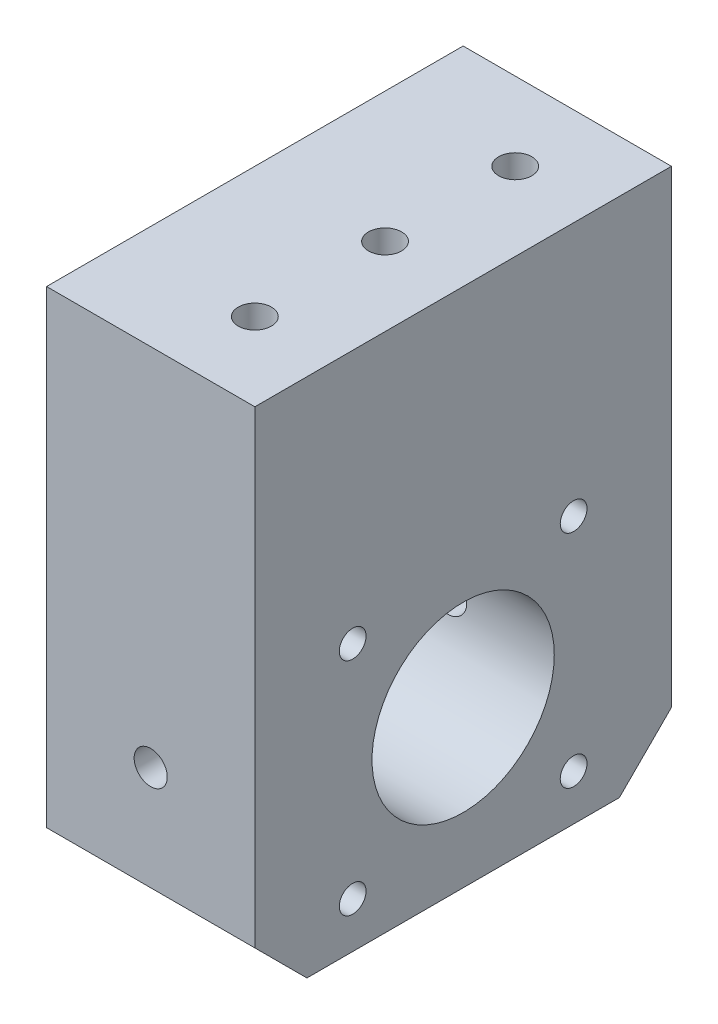
ISO-10303-21;
HEADER;
FILE_DESCRIPTION(('STEP AP214'),'2;1');
FILE_NAME('part.step','',(''),(''),'','','');
FILE_SCHEMA(('AUTOMOTIVE_DESIGN { 1 0 10303 214 1 1 1 1 }'));
ENDSEC;
DATA;
#1=APPLICATION_CONTEXT('core data for automotive mechanical design processes');
#2=APPLICATION_PROTOCOL_DEFINITION('international standard','automotive_design',2000,#1);
#3=PRODUCT_CONTEXT('',#1,'mechanical');
#4=PRODUCT('Part','Part','',(#3));
#5=PRODUCT_RELATED_PRODUCT_CATEGORY('part','',(#4));
#6=PRODUCT_DEFINITION_FORMATION('','',#4);
#7=PRODUCT_DEFINITION_CONTEXT('part definition',#1,'design');
#8=PRODUCT_DEFINITION('design','',#6,#7);
#9=PRODUCT_DEFINITION_SHAPE('','',#8);
#10=(LENGTH_UNIT() NAMED_UNIT(*) SI_UNIT(.MILLI.,.METRE.));
#11=(NAMED_UNIT(*) PLANE_ANGLE_UNIT() SI_UNIT($,.RADIAN.));
#12=(NAMED_UNIT(*) SI_UNIT($,.STERADIAN.) SOLID_ANGLE_UNIT());
#13=UNCERTAINTY_MEASURE_WITH_UNIT(LENGTH_MEASURE(1.E-05),#10,'distance_accuracy_value','');
#14=(GEOMETRIC_REPRESENTATION_CONTEXT(3) GLOBAL_UNCERTAINTY_ASSIGNED_CONTEXT((#13)) GLOBAL_UNIT_ASSIGNED_CONTEXT((#10,
#11,#12)) REPRESENTATION_CONTEXT('',''));
#15=CARTESIAN_POINT('',(0.,0.,0.));
#16=DIRECTION('',(0.,0.,1.));
#17=DIRECTION('',(1.,0.,0.));
#18=AXIS2_PLACEMENT_3D('',#15,#16,#17);
#19=CARTESIAN_POINT('',(25.4,-31.75,-25.4));
#20=DIRECTION('',(0.,0.,1.));
#21=DIRECTION('',(1.,0.,0.));
#22=AXIS2_PLACEMENT_3D('',#19,#20,#21);
#23=PLANE('',#22);
#24=CARTESIAN_POINT('',(12.7,-12.7,-25.4));
#25=DIRECTION('',(0.,0.,-1.));
#26=DIRECTION('',(-1.,0.,0.));
#27=AXIS2_PLACEMENT_3D('',#24,#25,#26);
#28=CIRCLE('',#27,2.0193);
#29=CARTESIAN_POINT('',(10.6807,-12.7,-25.4));
#30=VERTEX_POINT('',#29);
#31=EDGE_CURVE('E371',#30,#30,#28,.T.);
#32=ORIENTED_EDGE('',*,*,#31,.F.);
#33=EDGE_LOOP('',(#32));
#34=FACE_BOUND('',#33,.T.);
#35=DIRECTION('',(0.,1.,0.));
#36=VECTOR('',#35,1.);
#37=CARTESIAN_POINT('',(25.4,-31.75,-25.4));
#38=LINE('',#37,#36);
#39=CARTESIAN_POINT('',(25.4,-25.4,-25.4));
#40=VERTEX_POINT('',#39);
#41=CARTESIAN_POINT('',(25.4,31.75,-25.4));
#42=VERTEX_POINT('',#41);
#43=EDGE_CURVE('E142',#40,#42,#38,.T.);
#44=ORIENTED_EDGE('',*,*,#43,.F.);
#45=DIRECTION('',(-1.,0.,0.));
#46=VECTOR('',#45,1.);
#47=CARTESIAN_POINT('',(25.4,-25.4,-25.4));
#48=LINE('',#47,#46);
#49=CARTESIAN_POINT('',(0.,-25.4,-25.4));
#50=VERTEX_POINT('',#49);
#51=EDGE_CURVE('E11',#40,#50,#48,.T.);
#52=ORIENTED_EDGE('',*,*,#51,.T.);
#53=DIRECTION('',(0.,1.,0.));
#54=VECTOR('',#53,1.);
#55=CARTESIAN_POINT('',(0.,-31.75,-25.4));
#56=LINE('',#55,#54);
#57=CARTESIAN_POINT('',(0.,31.75,-25.4));
#58=VERTEX_POINT('',#57);
#59=EDGE_CURVE('E141',#50,#58,#56,.T.);
#60=ORIENTED_EDGE('',*,*,#59,.T.);
#61=DIRECTION('',(-1.,0.,0.));
#62=VECTOR('',#61,1.);
#63=CARTESIAN_POINT('',(25.4,31.75,-25.4));
#64=LINE('',#63,#62);
#65=EDGE_CURVE('E161',#42,#58,#64,.T.);
#66=ORIENTED_EDGE('',*,*,#65,.F.);
#67=EDGE_LOOP('',(#44,#52,#60,#66));
#68=FACE_BOUND('',#67,.T.);
#69=ADVANCED_FACE('F37',(#34,#68),#23,.F.);
#70=CARTESIAN_POINT('',(25.4,31.75,25.4));
#71=DIRECTION('',(0.,-1.,0.));
#72=DIRECTION('',(0.,0.,-1.));
#73=AXIS2_PLACEMENT_3D('',#70,#71,#72);
#74=PLANE('',#73);
#75=CARTESIAN_POINT('',(15.875,31.75,-15.875));
#76=DIRECTION('',(0.,1.,0.));
#77=DIRECTION('',(0.,0.,1.));
#78=AXIS2_PLACEMENT_3D('',#75,#76,#77);
#79=CIRCLE('',#78,2.0193);
#80=CARTESIAN_POINT('',(15.875,31.75,-13.8557));
#81=VERTEX_POINT('',#80);
#82=EDGE_CURVE('E117',#81,#81,#79,.T.);
#83=ORIENTED_EDGE('',*,*,#82,.F.);
#84=EDGE_LOOP('',(#83));
#85=FACE_BOUND('',#84,.T.);
#86=CARTESIAN_POINT('',(15.875,31.75,15.875));
#87=DIRECTION('',(0.,1.,0.));
#88=DIRECTION('',(0.,0.,1.));
#89=AXIS2_PLACEMENT_3D('',#86,#87,#88);
#90=CIRCLE('',#89,2.0193);
#91=CARTESIAN_POINT('',(15.875,31.75,17.8943));
#92=VERTEX_POINT('',#91);
#93=EDGE_CURVE('E116',#92,#92,#90,.T.);
#94=ORIENTED_EDGE('',*,*,#93,.F.);
#95=EDGE_LOOP('',(#94));
#96=FACE_BOUND('',#95,.T.);
#97=CARTESIAN_POINT('',(15.875,31.75,0.));
#98=DIRECTION('',(0.,1.,0.));
#99=DIRECTION('',(0.,0.,1.));
#100=AXIS2_PLACEMENT_3D('',#97,#98,#99);
#101=CIRCLE('',#100,2.0193);
#102=CARTESIAN_POINT('',(15.875,31.75,2.0193));
#103=VERTEX_POINT('',#102);
#104=EDGE_CURVE('E129',#103,#103,#101,.T.);
#105=ORIENTED_EDGE('',*,*,#104,.F.);
#106=EDGE_LOOP('',(#105));
#107=FACE_BOUND('',#106,.T.);
#108=DIRECTION('',(0.,0.,1.));
#109=VECTOR('',#108,1.);
#110=CARTESIAN_POINT('',(0.,31.75,25.4));
#111=LINE('',#110,#109);
#112=CARTESIAN_POINT('',(0.,31.75,25.4));
#113=VERTEX_POINT('',#112);
#114=EDGE_CURVE('E153',#58,#113,#111,.T.);
#115=ORIENTED_EDGE('',*,*,#114,.T.);
#116=DIRECTION('',(-1.,0.,0.));
#117=VECTOR('',#116,1.);
#118=CARTESIAN_POINT('',(25.4,31.75,25.4));
#119=LINE('',#118,#117);
#120=CARTESIAN_POINT('',(25.4,31.75,25.4));
#121=VERTEX_POINT('',#120);
#122=EDGE_CURVE('E151',#121,#113,#119,.T.);
#123=ORIENTED_EDGE('',*,*,#122,.F.);
#124=DIRECTION('',(0.,0.,1.));
#125=VECTOR('',#124,1.);
#126=CARTESIAN_POINT('',(25.4,31.75,25.4));
#127=LINE('',#126,#125);
#128=EDGE_CURVE('E144',#42,#121,#127,.T.);
#129=ORIENTED_EDGE('',*,*,#128,.F.);
#130=ORIENTED_EDGE('',*,*,#65,.T.);
#131=EDGE_LOOP('',(#115,#123,#129,#130));
#132=FACE_BOUND('',#131,.T.);
#133=ADVANCED_FACE('F263',(#85,#96,#107,#132),#74,.F.);
#134=CARTESIAN_POINT('',(25.4,-31.75,25.4));
#135=DIRECTION('',(0.,0.,-1.));
#136=DIRECTION('',(-1.,0.,0.));
#137=AXIS2_PLACEMENT_3D('',#134,#135,#136);
#138=PLANE('',#137);
#139=CARTESIAN_POINT('',(12.7,-12.7,25.4));
#140=DIRECTION('',(0.,0.,-1.));
#141=DIRECTION('',(-1.,0.,0.));
#142=AXIS2_PLACEMENT_3D('',#139,#140,#141);
#143=CIRCLE('',#142,2.01929999999999);
#144=CARTESIAN_POINT('',(10.6807,-12.7,25.4));
#145=VERTEX_POINT('',#144);
#146=EDGE_CURVE('E179',#145,#145,#143,.T.);
#147=ORIENTED_EDGE('',*,*,#146,.T.);
#148=EDGE_LOOP('',(#147));
#149=FACE_BOUND('',#148,.T.);
#150=DIRECTION('',(0.,-1.,0.));
#151=VECTOR('',#150,1.);
#152=CARTESIAN_POINT('',(0.,-31.75,25.4));
#153=LINE('',#152,#151);
#154=CARTESIAN_POINT('',(0.,-25.4,25.4));
#155=VERTEX_POINT('',#154);
#156=EDGE_CURVE('E155',#113,#155,#153,.T.);
#157=ORIENTED_EDGE('',*,*,#156,.T.);
#158=DIRECTION('',(1.,0.,0.));
#159=VECTOR('',#158,1.);
#160=CARTESIAN_POINT('',(25.4,-25.4,25.4));
#161=LINE('',#160,#159);
#162=CARTESIAN_POINT('',(25.4,-25.4,25.4));
#163=VERTEX_POINT('',#162);
#164=EDGE_CURVE('E66',#155,#163,#161,.T.);
#165=ORIENTED_EDGE('',*,*,#164,.T.);
#166=DIRECTION('',(0.,-1.,0.));
#167=VECTOR('',#166,1.);
#168=CARTESIAN_POINT('',(25.4,-31.75,25.4));
#169=LINE('',#168,#167);
#170=EDGE_CURVE('E147',#121,#163,#169,.T.);
#171=ORIENTED_EDGE('',*,*,#170,.F.);
#172=ORIENTED_EDGE('',*,*,#122,.T.);
#173=EDGE_LOOP('',(#157,#165,#171,#172));
#174=FACE_BOUND('',#173,.T.);
#175=ADVANCED_FACE('F271',(#149,#174),#138,.F.);
#176=CARTESIAN_POINT('',(25.4,-31.75,25.4));
#177=DIRECTION('',(0.,1.,0.));
#178=DIRECTION('',(0.,0.,1.));
#179=AXIS2_PLACEMENT_3D('',#176,#177,#178);
#180=PLANE('',#179);
#181=DIRECTION('',(0.,0.,-1.));
#182=VECTOR('',#181,1.);
#183=CARTESIAN_POINT('',(25.4,-31.75,25.4));
#184=LINE('',#183,#182);
#185=CARTESIAN_POINT('',(25.4,-31.75,19.05));
#186=VERTEX_POINT('',#185);
#187=CARTESIAN_POINT('',(25.4,-31.75,-19.05));
#188=VERTEX_POINT('',#187);
#189=EDGE_CURVE('E149',#186,#188,#184,.T.);
#190=ORIENTED_EDGE('',*,*,#189,.F.);
#191=DIRECTION('',(-1.,0.,0.));
#192=VECTOR('',#191,1.);
#193=CARTESIAN_POINT('',(25.4,-31.75,19.05));
#194=LINE('',#193,#192);
#195=CARTESIAN_POINT('',(0.,-31.75,19.05));
#196=VERTEX_POINT('',#195);
#197=EDGE_CURVE('E166',#186,#196,#194,.T.);
#198=ORIENTED_EDGE('',*,*,#197,.T.);
#199=DIRECTION('',(0.,0.,-1.));
#200=VECTOR('',#199,1.);
#201=CARTESIAN_POINT('',(0.,-31.75,25.4));
#202=LINE('',#201,#200);
#203=CARTESIAN_POINT('',(0.,-31.75,-19.05));
#204=VERTEX_POINT('',#203);
#205=EDGE_CURVE('E145',#196,#204,#202,.T.);
#206=ORIENTED_EDGE('',*,*,#205,.T.);
#207=DIRECTION('',(1.,0.,0.));
#208=VECTOR('',#207,1.);
#209=CARTESIAN_POINT('',(25.4,-31.75,-19.05));
#210=LINE('',#209,#208);
#211=EDGE_CURVE('E164',#204,#188,#210,.T.);
#212=ORIENTED_EDGE('',*,*,#211,.T.);
#213=EDGE_LOOP('',(#190,#198,#206,#212));
#214=FACE_BOUND('',#213,.T.);
#215=ADVANCED_FACE('F288',(#214),#180,.F.);
#216=CARTESIAN_POINT('',(25.4,0.,0.));
#217=DIRECTION('',(-1.,0.,0.));
#218=DIRECTION('',(0.,0.,1.));
#219=AXIS2_PLACEMENT_3D('',#216,#217,#218);
#220=PLANE('',#219);
#221=CARTESIAN_POINT('',(25.4,-26.1703841816035,-13.4703841816039));
#222=DIRECTION('',(-1.,0.,0.));
#223=DIRECTION('',(0.,0.,1.));
#224=AXIS2_PLACEMENT_3D('',#221,#222,#223);
#225=CIRCLE('',#224,1.63194999999999);
#226=CARTESIAN_POINT('',(25.4,-26.1703841816035,-11.8384341816039));
#227=VERTEX_POINT('',#226);
#228=EDGE_CURVE('E316',#227,#227,#225,.T.);
#229=ORIENTED_EDGE('',*,*,#228,.T.);
#230=EDGE_LOOP('',(#229));
#231=FACE_BOUND('',#230,.T.);
#232=CARTESIAN_POINT('',(25.4,-26.1703841816038,13.4703841816037));
#233=DIRECTION('',(-1.,0.,0.));
#234=DIRECTION('',(0.,0.,1.));
#235=AXIS2_PLACEMENT_3D('',#232,#233,#234);
#236=CIRCLE('',#235,1.63194999999999);
#237=CARTESIAN_POINT('',(25.4,-26.1703841816038,15.1023341816037));
#238=VERTEX_POINT('',#237);
#239=EDGE_CURVE('E320',#238,#238,#236,.T.);
#240=ORIENTED_EDGE('',*,*,#239,.T.);
#241=EDGE_LOOP('',(#240));
#242=FACE_BOUND('',#241,.T.);
#243=CARTESIAN_POINT('',(25.4,0.770384181603601,13.4703841816038));
#244=DIRECTION('',(-1.,0.,0.));
#245=DIRECTION('',(0.,0.,1.));
#246=AXIS2_PLACEMENT_3D('',#243,#244,#245);
#247=CIRCLE('',#246,1.63194999999999);
#248=CARTESIAN_POINT('',(25.4,0.770384181603601,15.1023341816038));
#249=VERTEX_POINT('',#248);
#250=EDGE_CURVE('E324',#249,#249,#247,.T.);
#251=ORIENTED_EDGE('',*,*,#250,.T.);
#252=EDGE_LOOP('',(#251));
#253=FACE_BOUND('',#252,.T.);
#254=CARTESIAN_POINT('',(25.4,0.77038418160379,-13.4703841816037));
#255=DIRECTION('',(-1.,0.,0.));
#256=DIRECTION('',(0.,0.,1.));
#257=AXIS2_PLACEMENT_3D('',#254,#255,#256);
#258=CIRCLE('',#257,1.63194999999999);
#259=CARTESIAN_POINT('',(25.4,0.77038418160379,-11.8384341816037));
#260=VERTEX_POINT('',#259);
#261=EDGE_CURVE('E123',#260,#260,#258,.T.);
#262=ORIENTED_EDGE('',*,*,#261,.T.);
#263=EDGE_LOOP('',(#262));
#264=FACE_BOUND('',#263,.T.);
#265=CARTESIAN_POINT('',(25.4,-12.7,0.));
#266=DIRECTION('',(1.,0.,0.));
#267=DIRECTION('',(0.,0.,-1.));
#268=AXIS2_PLACEMENT_3D('',#265,#266,#267);
#269=CIRCLE('',#268,11.1125);
#270=CARTESIAN_POINT('',(25.4,-12.7,-11.1125));
#271=VERTEX_POINT('',#270);
#272=EDGE_CURVE('E135',#271,#271,#269,.T.);
#273=ORIENTED_EDGE('',*,*,#272,.F.);
#274=EDGE_LOOP('',(#273));
#275=FACE_BOUND('',#274,.T.);
#276=ORIENTED_EDGE('',*,*,#170,.T.);
#277=DIRECTION('',(0.,0.707106781186549,0.707106781186546));
#278=VECTOR('',#277,1.);
#279=CARTESIAN_POINT('',(25.4,-31.75,19.05));
#280=LINE('',#279,#278);
#281=EDGE_CURVE('E50',#163,#186,#280,.F.);
#282=ORIENTED_EDGE('',*,*,#281,.T.);
#283=ORIENTED_EDGE('',*,*,#189,.T.);
#284=DIRECTION('',(0.,-0.707106781186546,0.707106781186549));
#285=VECTOR('',#284,1.);
#286=CARTESIAN_POINT('',(25.4,-25.4,-25.4));
#287=LINE('',#286,#285);
#288=EDGE_CURVE('E58',#188,#40,#287,.F.);
#289=ORIENTED_EDGE('',*,*,#288,.T.);
#290=ORIENTED_EDGE('',*,*,#43,.T.);
#291=ORIENTED_EDGE('',*,*,#128,.T.);
#292=EDGE_LOOP('',(#276,#282,#283,#289,#290,#291));
#293=FACE_BOUND('',#292,.T.);
#294=ADVANCED_FACE('F286',(#231,#242,#253,#264,#275,#293),#220,.F.);
#295=CARTESIAN_POINT('',(0.,0.,0.));
#296=DIRECTION('',(-1.,0.,0.));
#297=DIRECTION('',(0.,0.,1.));
#298=AXIS2_PLACEMENT_3D('',#295,#296,#297);
#299=PLANE('',#298);
#300=CARTESIAN_POINT('',(0.,-26.1703841816035,-13.4703841816039));
#301=DIRECTION('',(-1.,0.,0.));
#302=DIRECTION('',(0.,0.,1.));
#303=AXIS2_PLACEMENT_3D('',#300,#301,#302);
#304=CIRCLE('',#303,2.77876);
#305=CARTESIAN_POINT('',(0.,-26.1703841816035,-10.6916241816039));
#306=VERTEX_POINT('',#305);
#307=EDGE_CURVE('E367',#306,#306,#304,.T.);
#308=ORIENTED_EDGE('',*,*,#307,.F.);
#309=EDGE_LOOP('',(#308));
#310=FACE_BOUND('',#309,.T.);
#311=CARTESIAN_POINT('',(0.,-26.1703841816038,13.4703841816037));
#312=DIRECTION('',(-1.,0.,0.));
#313=DIRECTION('',(0.,0.,1.));
#314=AXIS2_PLACEMENT_3D('',#311,#312,#313);
#315=CIRCLE('',#314,2.77876);
#316=CARTESIAN_POINT('',(0.,-26.1703841816038,16.2491441816037));
#317=VERTEX_POINT('',#316);
#318=EDGE_CURVE('E357',#317,#317,#315,.T.);
#319=ORIENTED_EDGE('',*,*,#318,.F.);
#320=EDGE_LOOP('',(#319));
#321=FACE_BOUND('',#320,.T.);
#322=CARTESIAN_POINT('',(0.,0.770384181603601,13.4703841816038));
#323=DIRECTION('',(-1.,0.,0.));
#324=DIRECTION('',(0.,0.,1.));
#325=AXIS2_PLACEMENT_3D('',#322,#323,#324);
#326=CIRCLE('',#325,2.77876);
#327=CARTESIAN_POINT('',(0.,0.770384181603601,16.2491441816038));
#328=VERTEX_POINT('',#327);
#329=EDGE_CURVE('E347',#328,#328,#326,.T.);
#330=ORIENTED_EDGE('',*,*,#329,.F.);
#331=EDGE_LOOP('',(#330));
#332=FACE_BOUND('',#331,.T.);
#333=CARTESIAN_POINT('',(0.,0.77038418160379,-13.4703841816037));
#334=DIRECTION('',(-1.,0.,0.));
#335=DIRECTION('',(0.,0.,1.));
#336=AXIS2_PLACEMENT_3D('',#333,#334,#335);
#337=CIRCLE('',#336,2.77876);
#338=CARTESIAN_POINT('',(0.,0.77038418160379,-10.6916241816037));
#339=VERTEX_POINT('',#338);
#340=EDGE_CURVE('E337',#339,#339,#337,.T.);
#341=ORIENTED_EDGE('',*,*,#340,.F.);
#342=EDGE_LOOP('',(#341));
#343=FACE_BOUND('',#342,.T.);
#344=CARTESIAN_POINT('',(0.,-12.7,0.));
#345=DIRECTION('',(1.,0.,0.));
#346=DIRECTION('',(0.,0.,-1.));
#347=AXIS2_PLACEMENT_3D('',#344,#345,#346);
#348=CIRCLE('',#347,11.1125);
#349=CARTESIAN_POINT('',(0.,-12.7,-11.1125));
#350=VERTEX_POINT('',#349);
#351=EDGE_CURVE('E138',#350,#350,#348,.T.);
#352=ORIENTED_EDGE('',*,*,#351,.T.);
#353=EDGE_LOOP('',(#352));
#354=FACE_BOUND('',#353,.T.);
#355=ORIENTED_EDGE('',*,*,#205,.F.);
#356=DIRECTION('',(0.,-0.707106781186549,-0.707106781186546));
#357=VECTOR('',#356,1.);
#358=CARTESIAN_POINT('',(0.,-25.4,25.4));
#359=LINE('',#358,#357);
#360=EDGE_CURVE('E171',#196,#155,#359,.F.);
#361=ORIENTED_EDGE('',*,*,#360,.T.);
#362=ORIENTED_EDGE('',*,*,#156,.F.);
#363=ORIENTED_EDGE('',*,*,#114,.F.);
#364=ORIENTED_EDGE('',*,*,#59,.F.);
#365=DIRECTION('',(0.,0.707106781186546,-0.707106781186549));
#366=VECTOR('',#365,1.);
#367=CARTESIAN_POINT('',(0.,-25.4,-25.4));
#368=LINE('',#367,#366);
#369=EDGE_CURVE('E169',#50,#204,#368,.F.);
#370=ORIENTED_EDGE('',*,*,#369,.T.);
#371=EDGE_LOOP('',(#355,#361,#362,#363,#364,#370));
#372=FACE_BOUND('',#371,.T.);
#373=ADVANCED_FACE('F259',(#310,#321,#332,#343,#354,#372),#299,.T.);
#374=CARTESIAN_POINT('',(25.4,-12.7,0.));
#375=DIRECTION('',(1.,0.,0.));
#376=DIRECTION('',(0.,0.,-1.));
#377=AXIS2_PLACEMENT_3D('',#374,#375,#376);
#378=CYLINDRICAL_SURFACE('',#377,11.1125);
#379=CARTESIAN_POINT('',(10.6807,-12.7,-11.1125));
#380=CARTESIAN_POINT('',(10.6807043615049,-12.5875670101642,-11.1124979885135));
#381=CARTESIAN_POINT('',(10.6901219967104,-12.4750765359717,-11.1107759910982));
#382=CARTESIAN_POINT('',(10.7275219427909,-12.2532611999493,-11.1040725309227));
#383=CARTESIAN_POINT('',(10.7555203275981,-12.1439391646247,-11.0990882460572));
#384=CARTESIAN_POINT('',(10.8291997024264,-11.9317010936662,-11.0864182001841));
#385=CARTESIAN_POINT('',(10.8748651550943,-11.8287795211887,-11.0787348134541));
#386=CARTESIAN_POINT('',(10.9825392476807,-11.6320695321312,-11.061507249447));
#387=CARTESIAN_POINT('',(11.0445464081763,-11.5382802898489,-11.0519632406332));
#388=CARTESIAN_POINT('',(11.1838866538807,-11.3614288506713,-11.0319488145125));
#389=CARTESIAN_POINT('',(11.2613682223058,-11.2784845793769,-11.0214700131922));
#390=CARTESIAN_POINT('',(11.429138387391,-11.1266973079395,-11.0008298095361));
#391=CARTESIAN_POINT('',(11.5194278697649,-11.0578552838236,-10.9906684292106));
#392=CARTESIAN_POINT('',(11.7110776028682,-10.935741315498,-10.9717321974533));
#393=CARTESIAN_POINT('',(11.8125148398749,-10.8825883713314,-10.962968163853));
#394=CARTESIAN_POINT('',(12.0230647434077,-10.7941229318041,-10.9479365709283));
#395=CARTESIAN_POINT('',(12.1321767891471,-10.758808995399,-10.9416688099622));
#396=CARTESIAN_POINT('',(12.3537204940976,-10.70740049969,-10.9324235642105));
#397=CARTESIAN_POINT('',(12.4661030726281,-10.6911008608631,-10.9294109970154));
#398=CARTESIAN_POINT('',(12.6920452157279,-10.67754729268,-10.9269113681271));
#399=CARTESIAN_POINT('',(12.8056046804237,-10.6802917601941,-10.9274240096824));
#400=CARTESIAN_POINT('',(13.0291976376499,-10.7045819903841,-10.9318849084541));
#401=CARTESIAN_POINT('',(13.1392573464528,-10.7258953764055,-10.9357907011094));
#402=CARTESIAN_POINT('',(13.3542123971686,-10.7863528465502,-10.9465311853228));
#403=CARTESIAN_POINT('',(13.4591075315776,-10.8254976464623,-10.9533659944568));
#404=CARTESIAN_POINT('',(13.6614403084227,-10.9207364196955,-10.9692392211542));
#405=CARTESIAN_POINT('',(13.7588324232528,-10.9769249907746,-10.9782898818097));
#406=CARTESIAN_POINT('',(13.9428936345714,-11.1045893432607,-10.9975668225337));
#407=CARTESIAN_POINT('',(14.0295617056468,-11.1760665847617,-11.0077932148433));
#408=CARTESIAN_POINT('',(14.1910579883667,-11.3335360034449,-11.0284548489435));
#409=CARTESIAN_POINT('',(14.2656922458076,-11.4197271218982,-11.0388909434048));
#410=CARTESIAN_POINT('',(14.3994704908715,-11.6035098981212,-11.0586569463704));
#411=CARTESIAN_POINT('',(14.4586143405577,-11.7011016573985,-11.0679868450241));
#412=CARTESIAN_POINT('',(14.5597582875609,-11.9051119850795,-11.0845063665263));
#413=CARTESIAN_POINT('',(14.6017390922554,-12.0115403257749,-11.0916935783821));
#414=CARTESIAN_POINT('',(14.6671738486083,-12.2300976338335,-11.1030991079195));
#415=CARTESIAN_POINT('',(14.6906296469815,-12.3422260317847,-11.1073177215291));
#416=CARTESIAN_POINT('',(14.7180806392115,-12.5673310106839,-11.1122703306445));
#417=CARTESIAN_POINT('',(14.7223417255773,-12.6802741540027,-11.1130519332993));
#418=CARTESIAN_POINT('',(14.7119943094525,-12.9052594455282,-11.1111736388897));
#419=CARTESIAN_POINT('',(14.6973866755345,-13.0173016349692,-11.1085139002385));
#420=CARTESIAN_POINT('',(14.649937579232,-13.236467555566,-11.1000813655338));
#421=CARTESIAN_POINT('',(14.6172298206527,-13.3436211884153,-11.0943314055113));
#422=CARTESIAN_POINT('',(14.5346529918104,-13.5509240005381,-11.0803604679231));
#423=CARTESIAN_POINT('',(14.4847828124502,-13.6510727266259,-11.0721393306655));
#424=CARTESIAN_POINT('',(14.368702373107,-13.8426634946433,-11.0540192797017));
#425=CARTESIAN_POINT('',(14.3023285936664,-13.9340048759675,-11.044103907104));
#426=CARTESIAN_POINT('',(14.1553473811946,-14.1043483212225,-11.0237396081454));
#427=CARTESIAN_POINT('',(14.0747387052069,-14.1833493064838,-11.0132906352486));
#428=CARTESIAN_POINT('',(13.9003752732362,-14.327772656457,-10.9928800057886));
#429=CARTESIAN_POINT('',(13.8064695932729,-14.3930140710382,-10.9829260191508));
#430=CARTESIAN_POINT('',(13.6088754290993,-14.5067965525405,-10.9647834424417));
#431=CARTESIAN_POINT('',(13.5051872944722,-14.5553382159517,-10.9565947893193));
#432=CARTESIAN_POINT('',(13.2914443577046,-14.6340826219278,-10.9429694676423));
#433=CARTESIAN_POINT('',(13.1814217163337,-14.6643703559241,-10.9375200649759));
#434=CARTESIAN_POINT('',(12.9577416206193,-14.7060109257581,-10.9299603000043));
#435=CARTESIAN_POINT('',(12.8440845500117,-14.7173657539153,-10.9278495863684));
#436=CARTESIAN_POINT('',(12.6181727178947,-14.7207547019701,-10.9272232398915));
#437=CARTESIAN_POINT('',(12.505922282525,-14.7130740603095,-10.9286545311314));
#438=CARTESIAN_POINT('',(12.2843404973738,-14.6792323510812,-10.9348336294031));
#439=CARTESIAN_POINT('',(12.1750091326153,-14.6530713783497,-10.9395814194155));
#440=CARTESIAN_POINT('',(11.962510008679,-14.5831288340048,-10.951836829957));
#441=CARTESIAN_POINT('',(11.8593324025004,-14.5393763304268,-10.9593398959369));
#442=CARTESIAN_POINT('',(11.6617363507964,-14.435523294802,-10.9762639864209));
#443=CARTESIAN_POINT('',(11.5673184722485,-14.3754217055413,-10.9856851349478));
#444=CARTESIAN_POINT('',(11.3884896146515,-14.2395772544284,-11.0055496471138));
#445=CARTESIAN_POINT('',(11.3042382042446,-14.1636261296023,-11.0160055330534));
#446=CARTESIAN_POINT('',(11.1495803121319,-13.9986744742125,-11.0366659687779));
#447=CARTESIAN_POINT('',(11.0791770175928,-13.9096709478252,-11.0468704602323));
#448=CARTESIAN_POINT('',(10.9536657981643,-13.7202490949247,-11.0659783406538));
#449=CARTESIAN_POINT('',(10.898690988507,-13.6197413650116,-11.0748701101347));
#450=CARTESIAN_POINT('',(10.8064939873337,-13.4107898166554,-11.09023745001));
#451=CARTESIAN_POINT('',(10.7692548279621,-13.3023536984331,-11.0967153284989));
#452=CARTESIAN_POINT('',(10.721299371193,-13.1113065443776,-11.105177235031));
#453=CARTESIAN_POINT('',(10.7061001453388,-13.0298243050209,-11.1079080067159));
#454=CARTESIAN_POINT('',(10.685798969104,-12.8655717498812,-11.1115701093197));
#455=CARTESIAN_POINT('',(10.6806967879624,-12.7828014635791,-11.1125014813626));
#456=CARTESIAN_POINT('',(10.6807,-12.7,-11.1125));
#457=B_SPLINE_CURVE_WITH_KNOTS('',3,(#379,#380,#381,#382,#383,#384,#385,#386,#387,#388,#389,
#390,#391,#392,#393,#394,#395,#396,#397,#398,#399,#400,#401,#402,#403,#404,#405,#406,#407,#408,
#409,#410,#411,#412,#413,#414,#415,#416,#417,#418,#419,#420,#421,#422,#423,#424,#425,#426,#427,
#428,#429,#430,#431,#432,#433,#434,#435,#436,#437,#438,#439,#440,#441,#442,#443,#444,#445,#446,
#447,#448,#449,#450,#451,#452,#453,#454,#455,#456),.UNSPECIFIED.,.T.,.F.,(4,2,2,2,2,2,2,2,2,2,2,
2,2,2,2,2,2,2,2,2,2,2,2,2,2,2,2,2,2,2,2,2,2,2,2,2,2,2,4),(0.,0.336996202624953,0.67428431638085,
1.01127647297664,1.34823813197692,1.68860350423484,2.02899242547922,2.3719004640407,
2.71478079787919,3.05392775101648,3.3930461551662,3.72798072322002,4.06292873740647,
4.39977092309277,4.73664529215482,5.07849933289813,5.42035641763034,5.76259672719318,
6.1048029153111,6.44225385653524,6.77968926463193,7.11466471580606,7.44966181836009,
7.78812049165928,8.12660873296896,8.46930355200642,8.81198612922758,9.15306057434716,
9.4940991257621,9.83005834478046,10.1660158397568,10.5014204691529,10.8368467926518,
11.1769946871034,11.5172207757901,11.8602978766063,12.2030460898537,12.451233179623,
12.6994145971828),.UNSPECIFIED.);
#458=CARTESIAN_POINT('',(10.6807,-12.7,-11.1125));
#459=VERTEX_POINT('',#458);
#460=EDGE_CURVE('E41',#459,#459,#457,.T.);
#461=ORIENTED_EDGE('',*,*,#460,.T.);
#462=EDGE_LOOP('',(#461));
#463=FACE_BOUND('',#462,.T.);
#464=CARTESIAN_POINT('',(10.6807,-12.7,11.1125));
#465=CARTESIAN_POINT('',(10.6807043615049,-12.8124329898359,11.1124979885135));
#466=CARTESIAN_POINT('',(10.6901219967104,-12.9249234640283,11.1107759910982));
#467=CARTESIAN_POINT('',(10.7275219427909,-13.1467388000507,11.1040725309227));
#468=CARTESIAN_POINT('',(10.7555203275981,-13.2560608353753,11.0990882460572));
#469=CARTESIAN_POINT('',(10.8291997024264,-13.4682989063338,11.0864182001841));
#470=CARTESIAN_POINT('',(10.8748651550943,-13.5712204788113,11.0787348134541));
#471=CARTESIAN_POINT('',(10.9825392476807,-13.7679304678688,11.061507249447));
#472=CARTESIAN_POINT('',(11.0445464081763,-13.8617197101511,11.0519632406332));
#473=CARTESIAN_POINT('',(11.1838866538807,-14.0385711493287,11.0319488145125));
#474=CARTESIAN_POINT('',(11.2613682223058,-14.1215154206231,11.0214700131922));
#475=CARTESIAN_POINT('',(11.429138387391,-14.2733026920605,11.0008298095361));
#476=CARTESIAN_POINT('',(11.5194278697649,-14.3421447161765,10.9906684292106));
#477=CARTESIAN_POINT('',(11.7110776028682,-14.464258684502,10.9717321974533));
#478=CARTESIAN_POINT('',(11.8125148398749,-14.5174116286686,10.962968163853));
#479=CARTESIAN_POINT('',(12.0230647434077,-14.6058770681959,10.9479365709283));
#480=CARTESIAN_POINT('',(12.1321767891471,-14.641191004601,10.9416688099622));
#481=CARTESIAN_POINT('',(12.3537204940976,-14.69259950031,10.9324235642105));
#482=CARTESIAN_POINT('',(12.4661030726281,-14.7088991391369,10.9294109970154));
#483=CARTESIAN_POINT('',(12.6920452157279,-14.72245270732,10.9269113681271));
#484=CARTESIAN_POINT('',(12.8056046804237,-14.7197082398059,10.9274240096824));
#485=CARTESIAN_POINT('',(13.0291976376499,-14.6954180096159,10.9318849084541));
#486=CARTESIAN_POINT('',(13.1392573464528,-14.6741046235945,10.9357907011094));
#487=CARTESIAN_POINT('',(13.3542123971686,-14.6136471534498,10.9465311853228));
#488=CARTESIAN_POINT('',(13.4591075315776,-14.5745023535377,10.9533659944568));
#489=CARTESIAN_POINT('',(13.6614403084227,-14.4792635803045,10.9692392211542));
#490=CARTESIAN_POINT('',(13.7588324232528,-14.4230750092254,10.9782898818097));
#491=CARTESIAN_POINT('',(13.9428936345714,-14.2954106567393,10.9975668225337));
#492=CARTESIAN_POINT('',(14.0295617056468,-14.2239334152383,11.0077932148433));
#493=CARTESIAN_POINT('',(14.1910579883667,-14.0664639965551,11.0284548489435));
#494=CARTESIAN_POINT('',(14.2656922458076,-13.9802728781018,11.0388909434048));
#495=CARTESIAN_POINT('',(14.3994704908715,-13.7964901018788,11.0586569463704));
#496=CARTESIAN_POINT('',(14.4586143405577,-13.6988983426015,11.0679868450241));
#497=CARTESIAN_POINT('',(14.5597582875609,-13.4948880149206,11.0845063665263));
#498=CARTESIAN_POINT('',(14.6017390922553,-13.3884596742251,11.0916935783821));
#499=CARTESIAN_POINT('',(14.6671738486083,-13.1699023661666,11.1030991079195));
#500=CARTESIAN_POINT('',(14.6906296469815,-13.0577739682153,11.1073177215291));
#501=CARTESIAN_POINT('',(14.7180806392115,-12.8326689893161,11.1122703306445));
#502=CARTESIAN_POINT('',(14.7223417255773,-12.7197258459973,11.1130519332993));
#503=CARTESIAN_POINT('',(14.7119943094525,-12.4947405544718,11.1111736388897));
#504=CARTESIAN_POINT('',(14.6973866755345,-12.3826983650308,11.1085139002385));
#505=CARTESIAN_POINT('',(14.649937579232,-12.1635324444341,11.1000813655338));
#506=CARTESIAN_POINT('',(14.6172298206527,-12.0563788115847,11.0943314055113));
#507=CARTESIAN_POINT('',(14.5346529918104,-11.8490759994619,11.0803604679231));
#508=CARTESIAN_POINT('',(14.4847828124502,-11.7489272733742,11.0721393306655));
#509=CARTESIAN_POINT('',(14.368702373107,-11.5573365053567,11.0540192797017));
#510=CARTESIAN_POINT('',(14.3023285936664,-11.4659951240325,11.044103907104));
#511=CARTESIAN_POINT('',(14.1553473811946,-11.2956516787776,11.0237396081454));
#512=CARTESIAN_POINT('',(14.0747387052069,-11.2166506935162,11.0132906352486));
#513=CARTESIAN_POINT('',(13.9003752732362,-11.0722273435431,10.9928800057886));
#514=CARTESIAN_POINT('',(13.8064695932729,-11.0069859289618,10.9829260191508));
#515=CARTESIAN_POINT('',(13.6088754290993,-10.8932034474595,10.9647834424417));
#516=CARTESIAN_POINT('',(13.5051872944722,-10.8446617840483,10.9565947893193));
#517=CARTESIAN_POINT('',(13.2914443577046,-10.7659173780722,10.9429694676423));
#518=CARTESIAN_POINT('',(13.1814217163337,-10.7356296440759,10.9375200649759));
#519=CARTESIAN_POINT('',(12.9577416206193,-10.6939890742419,10.9299603000043));
#520=CARTESIAN_POINT('',(12.8440845500117,-10.6826342460848,10.9278495863684));
#521=CARTESIAN_POINT('',(12.6181727178947,-10.6792452980299,10.9272232398915));
#522=CARTESIAN_POINT('',(12.505922282525,-10.6869259396905,10.9286545311314));
#523=CARTESIAN_POINT('',(12.2843404973738,-10.7207676489188,10.9348336294031));
#524=CARTESIAN_POINT('',(12.1750091326153,-10.7469286216503,10.9395814194155));
#525=CARTESIAN_POINT('',(11.962510008679,-10.8168711659952,10.951836829957));
#526=CARTESIAN_POINT('',(11.8593324025004,-10.8606236695732,10.9593398959369));
#527=CARTESIAN_POINT('',(11.6617363507964,-10.964476705198,10.9762639864209));
#528=CARTESIAN_POINT('',(11.5673184722485,-11.0245782944587,10.9856851349478));
#529=CARTESIAN_POINT('',(11.3884896146515,-11.1604227455717,11.0055496471138));
#530=CARTESIAN_POINT('',(11.3042382042446,-11.2363738703977,11.0160055330534));
#531=CARTESIAN_POINT('',(11.1495803121319,-11.4013255257875,11.0366659687779));
#532=CARTESIAN_POINT('',(11.0791770175928,-11.4903290521748,11.0468704602323));
#533=CARTESIAN_POINT('',(10.9536657981643,-11.6797509050754,11.0659783406538));
#534=CARTESIAN_POINT('',(10.898690988507,-11.7802586349884,11.0748701101347));
#535=CARTESIAN_POINT('',(10.8064939873337,-11.9892101833446,11.09023745001));
#536=CARTESIAN_POINT('',(10.7692548279621,-12.0976463015669,11.0967153284989));
#537=CARTESIAN_POINT('',(10.721299371193,-12.2886934556224,11.105177235031));
#538=CARTESIAN_POINT('',(10.7061001453388,-12.3701756949791,11.1079080067159));
#539=CARTESIAN_POINT('',(10.685798969104,-12.5344282501188,11.1115701093197));
#540=CARTESIAN_POINT('',(10.6806967879624,-12.6171985364209,11.1125014813626));
#541=CARTESIAN_POINT('',(10.6807,-12.7,11.1125));
#542=B_SPLINE_CURVE_WITH_KNOTS('',3,(#464,#465,#466,#467,#468,#469,#470,#471,#472,#473,#474,
#475,#476,#477,#478,#479,#480,#481,#482,#483,#484,#485,#486,#487,#488,#489,#490,#491,#492,#493,
#494,#495,#496,#497,#498,#499,#500,#501,#502,#503,#504,#505,#506,#507,#508,#509,#510,#511,#512,
#513,#514,#515,#516,#517,#518,#519,#520,#521,#522,#523,#524,#525,#526,#527,#528,#529,#530,#531,
#532,#533,#534,#535,#536,#537,#538,#539,#540,#541),.UNSPECIFIED.,.T.,.F.,(4,2,2,2,2,2,2,2,2,2,2,
2,2,2,2,2,2,2,2,2,2,2,2,2,2,2,2,2,2,2,2,2,2,2,2,2,2,2,4),(0.,0.336996202624953,0.67428431638085,
1.01127647297664,1.34823813197692,1.68860350423484,2.02899242547922,2.3719004640407,
2.71478079787919,3.05392775101648,3.3930461551662,3.72798072322002,4.06292873740647,
4.39977092309277,4.73664529215482,5.07849933289813,5.42035641763034,5.76259672719318,
6.1048029153111,6.44225385653524,6.77968926463193,7.11466471580606,7.44966181836009,
7.78812049165928,8.12660873296895,8.46930355200642,8.81198612922757,9.15306057434715,
9.49409912576209,9.83005834478045,10.1660158397568,10.5014204691528,10.8368467926518,
11.1769946871034,11.5172207757901,11.8602978766063,12.2030460898537,12.451233179623,
12.6994145971828),.UNSPECIFIED.);
#543=CARTESIAN_POINT('',(10.6807,-12.7,11.1125));
#544=VERTEX_POINT('',#543);
#545=EDGE_CURVE('E175',#544,#544,#542,.T.);
#546=ORIENTED_EDGE('',*,*,#545,.T.);
#547=EDGE_LOOP('',(#546));
#548=FACE_BOUND('',#547,.T.);
#549=ORIENTED_EDGE('',*,*,#351,.F.);
#550=EDGE_LOOP('',(#549));
#551=FACE_BOUND('',#550,.T.);
#552=ORIENTED_EDGE('',*,*,#272,.T.);
#553=EDGE_LOOP('',(#552));
#554=FACE_BOUND('',#553,.T.);
#555=ADVANCED_FACE('F180',(#463,#548,#551,#554),#378,.F.);
#556=CARTESIAN_POINT('',(15.875,6.34999999999999,0.));
#557=DIRECTION('',(0.,1.,0.));
#558=DIRECTION('',(0.,0.,1.));
#559=AXIS2_PLACEMENT_3D('',#556,#557,#558);
#560=CONICAL_SURFACE('',#559,2.01929999999999,1.02974425867665);
#561=CARTESIAN_POINT('',(15.875,5.13668215199763,0.));
#562=VERTEX_POINT('',#561);
#563=VERTEX_LOOP('',#562);
#564=FACE_BOUND('',#563,.T.);
#565=CARTESIAN_POINT('',(15.875,6.34999999999999,0.));
#566=DIRECTION('',(0.,1.,0.));
#567=DIRECTION('',(0.,0.,1.));
#568=AXIS2_PLACEMENT_3D('',#565,#566,#567);
#569=CIRCLE('',#568,2.01929999999999);
#570=CARTESIAN_POINT('',(15.875,6.34999999999999,2.0193));
#571=VERTEX_POINT('',#570);
#572=EDGE_CURVE('E132',#571,#571,#569,.T.);
#573=ORIENTED_EDGE('',*,*,#572,.T.);
#574=EDGE_LOOP('',(#573));
#575=FACE_BOUND('',#574,.T.);
#576=ADVANCED_FACE('F251',(#564,#575),#560,.F.);
#577=CARTESIAN_POINT('',(15.875,31.75,0.));
#578=DIRECTION('',(0.,1.,0.));
#579=DIRECTION('',(0.,0.,1.));
#580=AXIS2_PLACEMENT_3D('',#577,#578,#579);
#581=CYLINDRICAL_SURFACE('',#580,2.0193);
#582=ORIENTED_EDGE('',*,*,#572,.F.);
#583=EDGE_LOOP('',(#582));
#584=FACE_BOUND('',#583,.T.);
#585=ORIENTED_EDGE('',*,*,#104,.T.);
#586=EDGE_LOOP('',(#585));
#587=FACE_BOUND('',#586,.T.);
#588=ADVANCED_FACE('F248',(#584,#587),#581,.F.);
#589=CARTESIAN_POINT('',(15.875,6.34999999999999,15.875));
#590=DIRECTION('',(0.,1.,0.));
#591=DIRECTION('',(0.,0.,1.));
#592=AXIS2_PLACEMENT_3D('',#589,#590,#591);
#593=CONICAL_SURFACE('',#592,2.01929999999999,1.02974425867665);
#594=CARTESIAN_POINT('',(15.875,5.13668215199763,15.875));
#595=VERTEX_POINT('',#594);
#596=VERTEX_LOOP('',#595);
#597=FACE_BOUND('',#596,.T.);
#598=CARTESIAN_POINT('',(15.875,6.34999999999999,15.875));
#599=DIRECTION('',(0.,1.,0.));
#600=DIRECTION('',(0.,0.,1.));
#601=AXIS2_PLACEMENT_3D('',#598,#599,#600);
#602=CIRCLE('',#601,2.01929999999999);
#603=CARTESIAN_POINT('',(15.875,6.34999999999999,17.8943));
#604=VERTEX_POINT('',#603);
#605=EDGE_CURVE('E120',#604,#604,#602,.T.);
#606=ORIENTED_EDGE('',*,*,#605,.T.);
#607=EDGE_LOOP('',(#606));
#608=FACE_BOUND('',#607,.T.);
#609=ADVANCED_FACE('F244',(#597,#608),#593,.F.);
#610=CARTESIAN_POINT('',(15.875,31.75,15.875));
#611=DIRECTION('',(0.,1.,0.));
#612=DIRECTION('',(0.,0.,1.));
#613=AXIS2_PLACEMENT_3D('',#610,#611,#612);
#614=CYLINDRICAL_SURFACE('',#613,2.0193);
#615=ORIENTED_EDGE('',*,*,#605,.F.);
#616=EDGE_LOOP('',(#615));
#617=FACE_BOUND('',#616,.T.);
#618=ORIENTED_EDGE('',*,*,#93,.T.);
#619=EDGE_LOOP('',(#618));
#620=FACE_BOUND('',#619,.T.);
#621=ADVANCED_FACE('F110',(#617,#620),#614,.F.);
#622=CARTESIAN_POINT('',(15.875,6.34999999999999,-15.875));
#623=DIRECTION('',(0.,1.,0.));
#624=DIRECTION('',(0.,0.,1.));
#625=AXIS2_PLACEMENT_3D('',#622,#623,#624);
#626=CONICAL_SURFACE('',#625,2.01929999999999,1.02974425867665);
#627=CARTESIAN_POINT('',(15.875,5.13668215199763,-15.875));
#628=VERTEX_POINT('',#627);
#629=VERTEX_LOOP('',#628);
#630=FACE_BOUND('',#629,.T.);
#631=CARTESIAN_POINT('',(15.875,6.34999999999999,-15.875));
#632=DIRECTION('',(0.,1.,0.));
#633=DIRECTION('',(0.,0.,1.));
#634=AXIS2_PLACEMENT_3D('',#631,#632,#633);
#635=CIRCLE('',#634,2.01929999999999);
#636=CARTESIAN_POINT('',(15.875,6.34999999999999,-13.8557));
#637=VERTEX_POINT('',#636);
#638=EDGE_CURVE('E114',#637,#637,#635,.T.);
#639=ORIENTED_EDGE('',*,*,#638,.T.);
#640=EDGE_LOOP('',(#639));
#641=FACE_BOUND('',#640,.T.);
#642=ADVANCED_FACE('F106',(#630,#641),#626,.F.);
#643=CARTESIAN_POINT('',(15.875,31.75,-15.875));
#644=DIRECTION('',(0.,1.,0.));
#645=DIRECTION('',(0.,0.,1.));
#646=AXIS2_PLACEMENT_3D('',#643,#644,#645);
#647=CYLINDRICAL_SURFACE('',#646,2.0193);
#648=ORIENTED_EDGE('',*,*,#638,.F.);
#649=EDGE_LOOP('',(#648));
#650=FACE_BOUND('',#649,.T.);
#651=ORIENTED_EDGE('',*,*,#82,.T.);
#652=EDGE_LOOP('',(#651));
#653=FACE_BOUND('',#652,.T.);
#654=ADVANCED_FACE('F109',(#650,#653),#647,.F.);
#655=CARTESIAN_POINT('',(0.,0.77038418160379,-13.4703841816037));
#656=DIRECTION('',(-1.,0.,0.));
#657=DIRECTION('',(0.,0.,1.));
#658=AXIS2_PLACEMENT_3D('',#655,#656,#657);
#659=CYLINDRICAL_SURFACE('',#658,1.63195);
#660=ORIENTED_EDGE('',*,*,#261,.F.);
#661=EDGE_LOOP('',(#660));
#662=FACE_BOUND('',#661,.T.);
#663=CARTESIAN_POINT('',(2.8448,0.77038418160379,-13.4703841816037));
#664=DIRECTION('',(-1.,0.,0.));
#665=DIRECTION('',(0.,0.,1.));
#666=AXIS2_PLACEMENT_3D('',#663,#664,#665);
#667=CIRCLE('',#666,1.63195);
#668=CARTESIAN_POINT('',(2.8448,0.77038418160379,-11.8384341816037));
#669=VERTEX_POINT('',#668);
#670=EDGE_CURVE('E330',#669,#669,#667,.T.);
#671=ORIENTED_EDGE('',*,*,#670,.T.);
#672=EDGE_LOOP('',(#671));
#673=FACE_BOUND('',#672,.T.);
#674=ADVANCED_FACE('F235',(#662,#673),#659,.F.);
#675=CARTESIAN_POINT('',(2.8448,2.40233418160379,-13.4703841816037));
#676=DIRECTION('',(1.,0.,0.));
#677=DIRECTION('',(0.,0.,-1.));
#678=AXIS2_PLACEMENT_3D('',#675,#676,#677);
#679=PLANE('',#678);
#680=ORIENTED_EDGE('',*,*,#670,.F.);
#681=EDGE_LOOP('',(#680));
#682=FACE_BOUND('',#681,.T.);
#683=CARTESIAN_POINT('',(2.8448,0.77038418160379,-13.4703841816037));
#684=DIRECTION('',(-1.,0.,0.));
#685=DIRECTION('',(0.,0.,1.));
#686=AXIS2_PLACEMENT_3D('',#683,#684,#685);
#687=CIRCLE('',#686,2.77876);
#688=CARTESIAN_POINT('',(2.8448,0.77038418160379,-10.6916241816037));
#689=VERTEX_POINT('',#688);
#690=EDGE_CURVE('E332',#689,#689,#687,.T.);
#691=ORIENTED_EDGE('',*,*,#690,.T.);
#692=EDGE_LOOP('',(#691));
#693=FACE_BOUND('',#692,.T.);
#694=ADVANCED_FACE('F231',(#682,#693),#679,.F.);
#695=CARTESIAN_POINT('',(0.,0.77038418160379,-13.4703841816037));
#696=DIRECTION('',(-1.,0.,0.));
#697=DIRECTION('',(0.,0.,1.));
#698=AXIS2_PLACEMENT_3D('',#695,#696,#697);
#699=CYLINDRICAL_SURFACE('',#698,2.77876);
#700=ORIENTED_EDGE('',*,*,#690,.F.);
#701=EDGE_LOOP('',(#700));
#702=FACE_BOUND('',#701,.T.);
#703=ORIENTED_EDGE('',*,*,#340,.T.);
#704=EDGE_LOOP('',(#703));
#705=FACE_BOUND('',#704,.T.);
#706=ADVANCED_FACE('F227',(#702,#705),#699,.F.);
#707=CARTESIAN_POINT('',(0.,0.770384181603601,13.4703841816038));
#708=DIRECTION('',(-1.,0.,0.));
#709=DIRECTION('',(0.,0.,1.));
#710=AXIS2_PLACEMENT_3D('',#707,#708,#709);
#711=CYLINDRICAL_SURFACE('',#710,1.63195);
#712=ORIENTED_EDGE('',*,*,#250,.F.);
#713=EDGE_LOOP('',(#712));
#714=FACE_BOUND('',#713,.T.);
#715=CARTESIAN_POINT('',(2.8448,0.770384181603601,13.4703841816038));
#716=DIRECTION('',(-1.,0.,0.));
#717=DIRECTION('',(0.,0.,1.));
#718=AXIS2_PLACEMENT_3D('',#715,#716,#717);
#719=CIRCLE('',#718,1.63195);
#720=CARTESIAN_POINT('',(2.8448,0.770384181603601,15.1023341816038));
#721=VERTEX_POINT('',#720);
#722=EDGE_CURVE('E341',#721,#721,#719,.T.);
#723=ORIENTED_EDGE('',*,*,#722,.T.);
#724=EDGE_LOOP('',(#723));
#725=FACE_BOUND('',#724,.T.);
#726=ADVANCED_FACE('F223',(#714,#725),#711,.F.);
#727=CARTESIAN_POINT('',(2.8448,2.4023341816036,13.4703841816038));
#728=DIRECTION('',(1.,0.,0.));
#729=DIRECTION('',(0.,0.,-1.));
#730=AXIS2_PLACEMENT_3D('',#727,#728,#729);
#731=PLANE('',#730);
#732=ORIENTED_EDGE('',*,*,#722,.F.);
#733=EDGE_LOOP('',(#732));
#734=FACE_BOUND('',#733,.T.);
#735=CARTESIAN_POINT('',(2.8448,0.770384181603601,13.4703841816038));
#736=DIRECTION('',(-1.,0.,0.));
#737=DIRECTION('',(0.,0.,1.));
#738=AXIS2_PLACEMENT_3D('',#735,#736,#737);
#739=CIRCLE('',#738,2.77876);
#740=CARTESIAN_POINT('',(2.8448,0.770384181603601,16.2491441816038));
#741=VERTEX_POINT('',#740);
#742=EDGE_CURVE('E344',#741,#741,#739,.T.);
#743=ORIENTED_EDGE('',*,*,#742,.T.);
#744=EDGE_LOOP('',(#743));
#745=FACE_BOUND('',#744,.T.);
#746=ADVANCED_FACE('F219',(#734,#745),#731,.F.);
#747=CARTESIAN_POINT('',(0.,0.770384181603601,13.4703841816038));
#748=DIRECTION('',(-1.,0.,0.));
#749=DIRECTION('',(0.,0.,1.));
#750=AXIS2_PLACEMENT_3D('',#747,#748,#749);
#751=CYLINDRICAL_SURFACE('',#750,2.77876);
#752=ORIENTED_EDGE('',*,*,#742,.F.);
#753=EDGE_LOOP('',(#752));
#754=FACE_BOUND('',#753,.T.);
#755=ORIENTED_EDGE('',*,*,#329,.T.);
#756=EDGE_LOOP('',(#755));
#757=FACE_BOUND('',#756,.T.);
#758=ADVANCED_FACE('F215',(#754,#757),#751,.F.);
#759=CARTESIAN_POINT('',(0.,-26.1703841816038,13.4703841816037));
#760=DIRECTION('',(-1.,0.,0.));
#761=DIRECTION('',(0.,0.,1.));
#762=AXIS2_PLACEMENT_3D('',#759,#760,#761);
#763=CYLINDRICAL_SURFACE('',#762,1.63195);
#764=ORIENTED_EDGE('',*,*,#239,.F.);
#765=EDGE_LOOP('',(#764));
#766=FACE_BOUND('',#765,.T.);
#767=CARTESIAN_POINT('',(2.8448,-26.1703841816038,13.4703841816037));
#768=DIRECTION('',(-1.,0.,0.));
#769=DIRECTION('',(0.,0.,1.));
#770=AXIS2_PLACEMENT_3D('',#767,#768,#769);
#771=CIRCLE('',#770,1.63195);
#772=CARTESIAN_POINT('',(2.8448,-26.1703841816038,15.1023341816037));
#773=VERTEX_POINT('',#772);
#774=EDGE_CURVE('E351',#773,#773,#771,.T.);
#775=ORIENTED_EDGE('',*,*,#774,.T.);
#776=EDGE_LOOP('',(#775));
#777=FACE_BOUND('',#776,.T.);
#778=ADVANCED_FACE('F211',(#766,#777),#763,.F.);
#779=CARTESIAN_POINT('',(2.8448,-24.5384341816038,13.4703841816037));
#780=DIRECTION('',(1.,0.,0.));
#781=DIRECTION('',(0.,0.,-1.));
#782=AXIS2_PLACEMENT_3D('',#779,#780,#781);
#783=PLANE('',#782);
#784=ORIENTED_EDGE('',*,*,#774,.F.);
#785=EDGE_LOOP('',(#784));
#786=FACE_BOUND('',#785,.T.);
#787=CARTESIAN_POINT('',(2.8448,-26.1703841816038,13.4703841816037));
#788=DIRECTION('',(-1.,0.,0.));
#789=DIRECTION('',(0.,0.,1.));
#790=AXIS2_PLACEMENT_3D('',#787,#788,#789);
#791=CIRCLE('',#790,2.77876);
#792=CARTESIAN_POINT('',(2.8448,-26.1703841816038,16.2491441816037));
#793=VERTEX_POINT('',#792);
#794=EDGE_CURVE('E354',#793,#793,#791,.T.);
#795=ORIENTED_EDGE('',*,*,#794,.T.);
#796=EDGE_LOOP('',(#795));
#797=FACE_BOUND('',#796,.T.);
#798=ADVANCED_FACE('F207',(#786,#797),#783,.F.);
#799=CARTESIAN_POINT('',(0.,-26.1703841816038,13.4703841816037));
#800=DIRECTION('',(-1.,0.,0.));
#801=DIRECTION('',(0.,0.,1.));
#802=AXIS2_PLACEMENT_3D('',#799,#800,#801);
#803=CYLINDRICAL_SURFACE('',#802,2.77876);
#804=ORIENTED_EDGE('',*,*,#794,.F.);
#805=EDGE_LOOP('',(#804));
#806=FACE_BOUND('',#805,.T.);
#807=ORIENTED_EDGE('',*,*,#318,.T.);
#808=EDGE_LOOP('',(#807));
#809=FACE_BOUND('',#808,.T.);
#810=ADVANCED_FACE('F203',(#806,#809),#803,.F.);
#811=CARTESIAN_POINT('',(0.,-26.1703841816035,-13.4703841816039));
#812=DIRECTION('',(-1.,0.,0.));
#813=DIRECTION('',(0.,0.,1.));
#814=AXIS2_PLACEMENT_3D('',#811,#812,#813);
#815=CYLINDRICAL_SURFACE('',#814,1.63195);
#816=ORIENTED_EDGE('',*,*,#228,.F.);
#817=EDGE_LOOP('',(#816));
#818=FACE_BOUND('',#817,.T.);
#819=CARTESIAN_POINT('',(2.8448,-26.1703841816035,-13.4703841816039));
#820=DIRECTION('',(-1.,0.,0.));
#821=DIRECTION('',(0.,0.,1.));
#822=AXIS2_PLACEMENT_3D('',#819,#820,#821);
#823=CIRCLE('',#822,1.63195);
#824=CARTESIAN_POINT('',(2.8448,-26.1703841816035,-11.8384341816039));
#825=VERTEX_POINT('',#824);
#826=EDGE_CURVE('E361',#825,#825,#823,.T.);
#827=ORIENTED_EDGE('',*,*,#826,.T.);
#828=EDGE_LOOP('',(#827));
#829=FACE_BOUND('',#828,.T.);
#830=ADVANCED_FACE('F199',(#818,#829),#815,.F.);
#831=CARTESIAN_POINT('',(2.8448,-24.5384341816035,-13.4703841816039));
#832=DIRECTION('',(1.,0.,0.));
#833=DIRECTION('',(0.,0.,-1.));
#834=AXIS2_PLACEMENT_3D('',#831,#832,#833);
#835=PLANE('',#834);
#836=ORIENTED_EDGE('',*,*,#826,.F.);
#837=EDGE_LOOP('',(#836));
#838=FACE_BOUND('',#837,.T.);
#839=CARTESIAN_POINT('',(2.8448,-26.1703841816035,-13.4703841816039));
#840=DIRECTION('',(-1.,0.,0.));
#841=DIRECTION('',(0.,0.,1.));
#842=AXIS2_PLACEMENT_3D('',#839,#840,#841);
#843=CIRCLE('',#842,2.77876);
#844=CARTESIAN_POINT('',(2.8448,-26.1703841816035,-10.6916241816039));
#845=VERTEX_POINT('',#844);
#846=EDGE_CURVE('E364',#845,#845,#843,.T.);
#847=ORIENTED_EDGE('',*,*,#846,.T.);
#848=EDGE_LOOP('',(#847));
#849=FACE_BOUND('',#848,.T.);
#850=ADVANCED_FACE('F195',(#838,#849),#835,.F.);
#851=CARTESIAN_POINT('',(0.,-26.1703841816035,-13.4703841816039));
#852=DIRECTION('',(-1.,0.,0.));
#853=DIRECTION('',(0.,0.,1.));
#854=AXIS2_PLACEMENT_3D('',#851,#852,#853);
#855=CYLINDRICAL_SURFACE('',#854,2.77876);
#856=ORIENTED_EDGE('',*,*,#846,.F.);
#857=EDGE_LOOP('',(#856));
#858=FACE_BOUND('',#857,.T.);
#859=ORIENTED_EDGE('',*,*,#307,.T.);
#860=EDGE_LOOP('',(#859));
#861=FACE_BOUND('',#860,.T.);
#862=ADVANCED_FACE('F190',(#858,#861),#855,.F.);
#863=CARTESIAN_POINT('',(25.4,-31.75,19.05));
#864=DIRECTION('',(0.,0.707106781186546,-0.707106781186549));
#865=DIRECTION('',(-1.,0.,0.));
#866=AXIS2_PLACEMENT_3D('',#863,#864,#865);
#867=PLANE('',#866);
#868=ORIENTED_EDGE('',*,*,#281,.F.);
#869=ORIENTED_EDGE('',*,*,#164,.F.);
#870=ORIENTED_EDGE('',*,*,#360,.F.);
#871=ORIENTED_EDGE('',*,*,#197,.F.);
#872=EDGE_LOOP('',(#868,#869,#870,#871));
#873=FACE_BOUND('',#872,.T.);
#874=ADVANCED_FACE('F194',(#873),#867,.F.);
#875=CARTESIAN_POINT('',(25.4,-25.4,-25.4));
#876=DIRECTION('',(0.,0.707106781186549,0.707106781186546));
#877=DIRECTION('',(-1.,0.,0.));
#878=AXIS2_PLACEMENT_3D('',#875,#876,#877);
#879=PLANE('',#878);
#880=ORIENTED_EDGE('',*,*,#288,.F.);
#881=ORIENTED_EDGE('',*,*,#211,.F.);
#882=ORIENTED_EDGE('',*,*,#369,.F.);
#883=ORIENTED_EDGE('',*,*,#51,.F.);
#884=EDGE_LOOP('',(#880,#881,#882,#883));
#885=FACE_BOUND('',#884,.T.);
#886=ADVANCED_FACE('F39',(#885),#879,.F.);
#887=CARTESIAN_POINT('',(12.7,-12.7,-25.4));
#888=DIRECTION('',(0.,0.,-1.));
#889=DIRECTION('',(-1.,0.,0.));
#890=AXIS2_PLACEMENT_3D('',#887,#888,#889);
#891=CYLINDRICAL_SURFACE('',#890,2.0193);
#892=ORIENTED_EDGE('',*,*,#146,.F.);
#893=EDGE_LOOP('',(#892));
#894=FACE_BOUND('',#893,.T.);
#895=ORIENTED_EDGE('',*,*,#545,.F.);
#896=EDGE_LOOP('',(#895));
#897=FACE_BOUND('',#896,.T.);
#898=ADVANCED_FACE('F188',(#894,#897),#891,.F.);
#899=ORIENTED_EDGE('',*,*,#31,.T.);
#900=EDGE_LOOP('',(#899));
#901=FACE_BOUND('',#900,.T.);
#902=ORIENTED_EDGE('',*,*,#460,.F.);
#903=EDGE_LOOP('',(#902));
#904=FACE_BOUND('',#903,.T.);
#905=ADVANCED_FACE('F184',(#901,#904),#891,.F.);
#906=CLOSED_SHELL('',(#69,#133,#175,#215,#294,#373,#555,#576,#588,#609,#621,#642,#654,#674,#694,
#706,#726,#746,#758,#778,#798,#810,#830,#850,#862,#874,#886,#898,#905));
#907=MANIFOLD_SOLID_BREP('B2',#906);
#908=ADVANCED_BREP_SHAPE_REPRESENTATION('',(#18,#907),#14);
#909=SHAPE_DEFINITION_REPRESENTATION(#9,#908);
ENDSEC;
END-ISO-10303-21;
